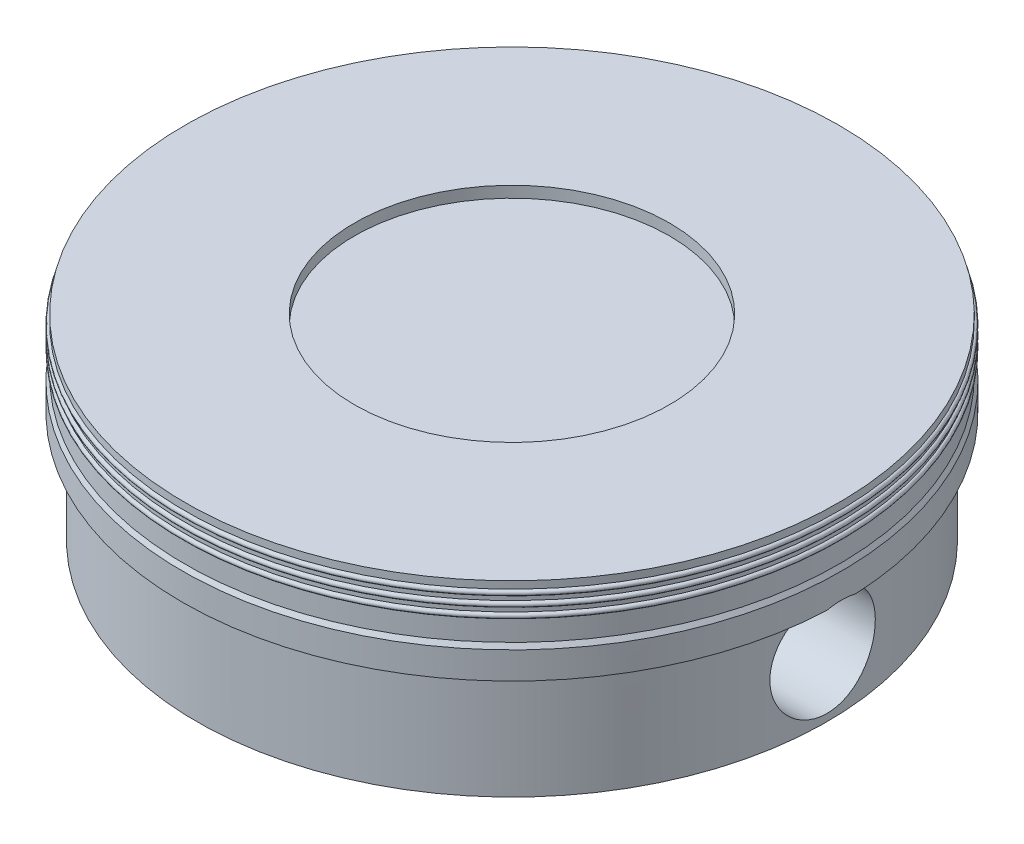
ISO-10303-21;
HEADER;
FILE_DESCRIPTION(('STEP AP214'),'2;1');
FILE_NAME('part.step','',(''),(''),'','','');
FILE_SCHEMA(('AUTOMOTIVE_DESIGN { 1 0 10303 214 1 1 1 1 }'));
ENDSEC;
DATA;
#1=APPLICATION_CONTEXT('core data for automotive mechanical design processes');
#2=APPLICATION_PROTOCOL_DEFINITION('international standard','automotive_design',2000,#1);
#3=PRODUCT_CONTEXT('',#1,'mechanical');
#4=PRODUCT('Part','Part','',(#3));
#5=PRODUCT_RELATED_PRODUCT_CATEGORY('part','',(#4));
#6=PRODUCT_DEFINITION_FORMATION('','',#4);
#7=PRODUCT_DEFINITION_CONTEXT('part definition',#1,'design');
#8=PRODUCT_DEFINITION('design','',#6,#7);
#9=PRODUCT_DEFINITION_SHAPE('','',#8);
#10=(LENGTH_UNIT() NAMED_UNIT(*) SI_UNIT(.MILLI.,.METRE.));
#11=(NAMED_UNIT(*) PLANE_ANGLE_UNIT() SI_UNIT($,.RADIAN.));
#12=(NAMED_UNIT(*) SI_UNIT($,.STERADIAN.) SOLID_ANGLE_UNIT());
#13=UNCERTAINTY_MEASURE_WITH_UNIT(LENGTH_MEASURE(1.E-05),#10,'distance_accuracy_value','');
#14=(GEOMETRIC_REPRESENTATION_CONTEXT(3) GLOBAL_UNCERTAINTY_ASSIGNED_CONTEXT((#13)) GLOBAL_UNIT_ASSIGNED_CONTEXT((#10,
#11,#12)) REPRESENTATION_CONTEXT('',''));
#15=CARTESIAN_POINT('',(0.,0.,0.));
#16=DIRECTION('',(0.,0.,1.));
#17=DIRECTION('',(1.,0.,0.));
#18=AXIS2_PLACEMENT_3D('',#15,#16,#17);
#19=CARTESIAN_POINT('',(5.,1.68,0.));
#20=DIRECTION('',(0.,-1.,0.));
#21=DIRECTION('',(0.,0.,-1.));
#22=AXIS2_PLACEMENT_3D('',#19,#20,#21);
#23=PLANE('',#22);
#24=DIRECTION('',(1.,0.,0.));
#25=VECTOR('',#24,1.);
#26=CARTESIAN_POINT('',(-5.,1.68,-0.217025344142108));
#27=LINE('',#26,#25);
#28=CARTESIAN_POINT('',(-4.99528777949779,1.68,-0.217025344142108));
#29=VERTEX_POINT('',#28);
#30=CARTESIAN_POINT('',(-4.77507068010516,1.68,-0.217025344142108));
#31=VERTEX_POINT('',#30);
#32=EDGE_CURVE('E115',#29,#31,#27,.T.);
#33=ORIENTED_EDGE('',*,*,#32,.F.);
#34=CARTESIAN_POINT('',(0.,1.68,0.));
#35=DIRECTION('',(0.,-1.,0.));
#36=DIRECTION('',(0.,0.,-1.));
#37=AXIS2_PLACEMENT_3D('',#34,#35,#36);
#38=CIRCLE('',#37,5.);
#39=CARTESIAN_POINT('',(4.99528777949779,1.68,-0.217025344142108));
#40=VERTEX_POINT('',#39);
#41=EDGE_CURVE('E129',#29,#40,#38,.T.);
#42=ORIENTED_EDGE('',*,*,#41,.T.);
#43=CARTESIAN_POINT('',(4.77507068010516,1.68,-0.217025344142108));
#44=VERTEX_POINT('',#43);
#45=EDGE_CURVE('E134',#44,#40,#27,.T.);
#46=ORIENTED_EDGE('',*,*,#45,.F.);
#47=CARTESIAN_POINT('',(0.,1.68,0.));
#48=DIRECTION('',(0.,-1.,0.));
#49=DIRECTION('',(0.,0.,-1.));
#50=AXIS2_PLACEMENT_3D('',#47,#48,#49);
#51=CIRCLE('',#50,4.78);
#52=EDGE_CURVE('E131',#31,#44,#51,.T.);
#53=ORIENTED_EDGE('',*,*,#52,.F.);
#54=EDGE_LOOP('',(#33,#42,#46,#53));
#55=FACE_BOUND('',#54,.T.);
#56=ADVANCED_FACE('F34',(#55),#23,.T.);
#57=CARTESIAN_POINT('',(0.,0.,0.));
#58=DIRECTION('',(0.,-1.,0.));
#59=DIRECTION('',(0.,0.,-1.));
#60=AXIS2_PLACEMENT_3D('',#57,#58,#59);
#61=CYLINDRICAL_SURFACE('',#60,3.43);
#62=DIRECTION('',(0.,-1.,0.));
#63=VECTOR('',#62,1.);
#64=CARTESIAN_POINT('',(1.75,2.972,-2.94998305079877));
#65=LINE('',#64,#63);
#66=CARTESIAN_POINT('',(1.75,1.93,-2.94998305079877));
#67=VERTEX_POINT('',#66);
#68=CARTESIAN_POINT('',(1.75,0.,-2.94998305079877));
#69=VERTEX_POINT('',#68);
#70=EDGE_CURVE('E221',#67,#69,#65,.T.);
#71=ORIENTED_EDGE('',*,*,#70,.F.);
#72=CARTESIAN_POINT('',(0.,1.93,0.));
#73=DIRECTION('',(0.,-1.,0.));
#74=DIRECTION('',(0.,0.,-1.));
#75=AXIS2_PLACEMENT_3D('',#72,#73,#74);
#76=CIRCLE('',#75,3.43);
#77=CARTESIAN_POINT('',(-1.75,1.93,-2.94998305079877));
#78=VERTEX_POINT('',#77);
#79=EDGE_CURVE('E247',#78,#67,#76,.T.);
#80=ORIENTED_EDGE('',*,*,#79,.F.);
#81=DIRECTION('',(0.,-1.,0.));
#82=VECTOR('',#81,1.);
#83=CARTESIAN_POINT('',(-1.75,2.972,-2.94998305079877));
#84=LINE('',#83,#82);
#85=CARTESIAN_POINT('',(-1.75,0.,-2.94998305079877));
#86=VERTEX_POINT('',#85);
#87=EDGE_CURVE('E237',#78,#86,#84,.T.);
#88=ORIENTED_EDGE('',*,*,#87,.T.);
#89=CARTESIAN_POINT('',(0.,0.,0.));
#90=DIRECTION('',(0.,-1.,0.));
#91=DIRECTION('',(0.,0.,-1.));
#92=AXIS2_PLACEMENT_3D('',#89,#90,#91);
#93=CIRCLE('',#92,3.43);
#94=EDGE_CURVE('E11',#86,#69,#93,.T.);
#95=ORIENTED_EDGE('',*,*,#94,.T.);
#96=EDGE_LOOP('',(#71,#80,#88,#95));
#97=FACE_BOUND('',#96,.T.);
#98=ADVANCED_FACE('F298',(#97),#61,.F.);
#99=DIRECTION('',(0.,-1.,0.));
#100=VECTOR('',#99,1.);
#101=CARTESIAN_POINT('',(1.75,2.972,2.94998305079877));
#102=LINE('',#101,#100);
#103=CARTESIAN_POINT('',(1.75,1.93,2.94998305079877));
#104=VERTEX_POINT('',#103);
#105=CARTESIAN_POINT('',(1.75,0.,2.94998305079877));
#106=VERTEX_POINT('',#105);
#107=EDGE_CURVE('E227',#104,#106,#102,.T.);
#108=ORIENTED_EDGE('',*,*,#107,.T.);
#109=CARTESIAN_POINT('',(-1.75,0.,2.94998305079877));
#110=VERTEX_POINT('',#109);
#111=EDGE_CURVE('E43',#106,#110,#93,.T.);
#112=ORIENTED_EDGE('',*,*,#111,.T.);
#113=DIRECTION('',(0.,-1.,0.));
#114=VECTOR('',#113,1.);
#115=CARTESIAN_POINT('',(-1.75,2.972,2.94998305079877));
#116=LINE('',#115,#114);
#117=CARTESIAN_POINT('',(-1.75,1.93,2.94998305079877));
#118=VERTEX_POINT('',#117);
#119=EDGE_CURVE('E236',#118,#110,#116,.T.);
#120=ORIENTED_EDGE('',*,*,#119,.F.);
#121=EDGE_CURVE('E232',#104,#118,#76,.T.);
#122=ORIENTED_EDGE('',*,*,#121,.F.);
#123=EDGE_LOOP('',(#108,#112,#120,#122));
#124=FACE_BOUND('',#123,.T.);
#125=ADVANCED_FACE('F36',(#124),#61,.F.);
#126=CARTESIAN_POINT('',(4.78,0.,0.));
#127=DIRECTION('',(0.,-1.,0.));
#128=DIRECTION('',(0.,0.,-1.));
#129=AXIS2_PLACEMENT_3D('',#126,#127,#128);
#130=PLANE('',#129);
#131=CARTESIAN_POINT('',(0.,0.,0.));
#132=DIRECTION('',(0.,-1.,0.));
#133=DIRECTION('',(0.,0.,-1.));
#134=AXIS2_PLACEMENT_3D('',#131,#132,#133);
#135=CIRCLE('',#134,4.78);
#136=CARTESIAN_POINT('',(0.,0.,-4.78));
#137=VERTEX_POINT('',#136);
#138=EDGE_CURVE('E149',#137,#137,#135,.T.);
#139=ORIENTED_EDGE('',*,*,#138,.T.);
#140=EDGE_LOOP('',(#139));
#141=FACE_BOUND('',#140,.T.);
#142=ORIENTED_EDGE('',*,*,#94,.F.);
#143=DIRECTION('',(0.,0.,1.));
#144=VECTOR('',#143,1.);
#145=CARTESIAN_POINT('',(-1.75,0.,2.94998305079877));
#146=LINE('',#145,#144);
#147=EDGE_CURVE('E229',#86,#110,#146,.T.);
#148=ORIENTED_EDGE('',*,*,#147,.T.);
#149=ORIENTED_EDGE('',*,*,#111,.F.);
#150=DIRECTION('',(0.,0.,-1.));
#151=VECTOR('',#150,1.);
#152=CARTESIAN_POINT('',(1.75,0.,2.94998305079877));
#153=LINE('',#152,#151);
#154=EDGE_CURVE('E220',#106,#69,#153,.T.);
#155=ORIENTED_EDGE('',*,*,#154,.T.);
#156=EDGE_LOOP('',(#142,#148,#149,#155));
#157=FACE_BOUND('',#156,.T.);
#158=ADVANCED_FACE('F308',(#141,#157),#130,.T.);
#159=CARTESIAN_POINT('',(0.,0.,0.));
#160=DIRECTION('',(0.,-1.,0.));
#161=DIRECTION('',(0.,0.,-1.));
#162=AXIS2_PLACEMENT_3D('',#159,#160,#161);
#163=CYLINDRICAL_SURFACE('',#162,4.78);
#164=CARTESIAN_POINT('',(-4.77507068010516,1.68,-0.217025344142108));
#165=CARTESIAN_POINT('',(-4.77311674454233,1.66781545501285,-0.260389997840914));
#166=CARTESIAN_POINT('',(-4.77058685151336,1.65191421075662,-0.302658617409448));
#167=CARTESIAN_POINT('',(-4.76473120839085,1.61331601743286,-0.383861318073952));
#168=CARTESIAN_POINT('',(-4.76140626252574,1.59062592976735,-0.422798715140795));
#169=CARTESIAN_POINT('',(-4.75431061348991,1.53905634512323,-0.496294501252224));
#170=CARTESIAN_POINT('',(-4.75053983511395,1.51017580323822,-0.530852149456165));
#171=CARTESIAN_POINT('',(-4.7429770373271,1.44704123469794,-0.594642145847165));
#172=CARTESIAN_POINT('',(-4.7391850190532,1.41278749307178,-0.623874776329791));
#173=CARTESIAN_POINT('',(-4.73198231554192,1.33963445348543,-0.676351887298078));
#174=CARTESIAN_POINT('',(-4.72857386348334,1.30071042802205,-0.699562233458879));
#175=CARTESIAN_POINT('',(-4.722554449733,1.21945126202537,-0.73910854464259));
#176=CARTESIAN_POINT('',(-4.7199435335669,1.17711592693891,-0.755444117253648));
#177=CARTESIAN_POINT('',(-4.71583989573606,1.09055475865284,-0.780651928805573));
#178=CARTESIAN_POINT('',(-4.71433931182688,1.04634460825845,-0.789576699682988));
#179=CARTESIAN_POINT('',(-4.71260225277348,0.957032751672788,-0.799880045235941));
#180=CARTESIAN_POINT('',(-4.71236561191707,0.911931163133861,-0.801259609143973));
#181=CARTESIAN_POINT('',(-4.71317900815314,0.822677727153014,-0.796460213173481));
#182=CARTESIAN_POINT('',(-4.71421397175652,0.778520946037444,-0.790369803192592));
#183=CARTESIAN_POINT('',(-4.7174257766452,0.691867355104175,-0.770966694821859));
#184=CARTESIAN_POINT('',(-4.71960265705314,0.649370602213479,-0.757653748983772));
#185=CARTESIAN_POINT('',(-4.72485660636636,0.56713060397223,-0.724165813365828));
#186=CARTESIAN_POINT('',(-4.72793556010964,0.527393341700135,-0.703976441127867));
#187=CARTESIAN_POINT('',(-4.73464750015667,0.451846186290576,-0.657317733090283));
#188=CARTESIAN_POINT('',(-4.7382805289058,0.416036594397233,-0.630847916085479));
#189=CARTESIAN_POINT('',(-4.74574814670546,0.348880399682881,-0.571982147608413));
#190=CARTESIAN_POINT('',(-4.74958470463595,0.317596008918017,-0.539515441920733));
#191=CARTESIAN_POINT('',(-4.75698830468753,0.26090071643192,-0.469776200289964));
#192=CARTESIAN_POINT('',(-4.76055533948057,0.23548997437027,-0.43250353375245));
#193=CARTESIAN_POINT('',(-4.76703400126186,0.1911835506644,-0.354034042364042));
#194=CARTESIAN_POINT('',(-4.76994321603747,0.172311716637692,-0.312823538628382));
#195=CARTESIAN_POINT('',(-4.77476061322142,0.141776205047494,-0.227758381569901));
#196=CARTESIAN_POINT('',(-4.77666887341471,0.13011196736357,-0.183903934005386));
#197=CARTESIAN_POINT('',(-4.77925311923535,0.114437264129416,-0.0953004936420972));
#198=CARTESIAN_POINT('',(-4.77994216086845,0.110345684668121,-0.0505662307842665));
#199=CARTESIAN_POINT('',(-4.78005079027309,0.109696432804759,0.0389570033491305));
#200=CARTESIAN_POINT('',(-4.7794704468681,0.113138351951783,0.0837459715270977));
#201=CARTESIAN_POINT('',(-4.77711565664269,0.127387693539074,0.171718625850184));
#202=CARTESIAN_POINT('',(-4.77535116971636,0.138133690579977,0.214912556661851));
#203=CARTESIAN_POINT('',(-4.77083222456877,0.16660481485125,0.298879816869771));
#204=CARTESIAN_POINT('',(-4.76807772295137,0.184330248020286,0.33965304006584));
#205=CARTESIAN_POINT('',(-4.76185735284645,0.226392438799284,0.417933619716713));
#206=CARTESIAN_POINT('',(-4.75838675692455,0.25077349929401,0.455416783633629));
#207=CARTESIAN_POINT('',(-4.75112593986705,0.305410165362693,0.525790773700132));
#208=CARTESIAN_POINT('',(-4.74733569379902,0.335666229422007,0.558681241091011));
#209=CARTESIAN_POINT('',(-4.73980727708292,0.401614121406434,0.619333370466703));
#210=CARTESIAN_POINT('',(-4.73607022605573,0.437365119679956,0.64703088003082));
#211=CARTESIAN_POINT('',(-4.72911708259974,0.513054069657324,0.69603621201228));
#212=CARTESIAN_POINT('',(-4.72590098778355,0.552992002172202,0.717344063712075));
#213=CARTESIAN_POINT('',(-4.72036394830086,0.635881027755403,0.752920794222775));
#214=CARTESIAN_POINT('',(-4.71804171930698,0.678827692065178,0.767199780566341));
#215=CARTESIAN_POINT('',(-4.71455803308112,0.766555057162941,0.788326469780904));
#216=CARTESIAN_POINT('',(-4.71339644749025,0.811335554571722,0.795174994415193));
#217=CARTESIAN_POINT('',(-4.71237792548226,0.900855119314812,0.801188832970666));
#218=CARTESIAN_POINT('',(-4.712504716309,0.945587583461906,0.800449977549886));
#219=CARTESIAN_POINT('',(-4.7140089366155,1.03428625093363,0.791542596891841));
#220=CARTESIAN_POINT('',(-4.71538641020498,1.07825242717667,0.783373809611892));
#221=CARTESIAN_POINT('',(-4.71922515448502,1.16399796218298,0.759903429890645));
#222=CARTESIAN_POINT('',(-4.72168213100792,1.2057852589046,0.744630084761228));
#223=CARTESIAN_POINT('',(-4.72740111237165,1.28620740457162,0.707411877504114));
#224=CARTESIAN_POINT('',(-4.73066306052802,1.32484247523554,0.685467485112687));
#225=CARTESIAN_POINT('',(-4.73766913754596,1.39832684053879,0.635246489063792));
#226=CARTESIAN_POINT('',(-4.74141811176241,1.43313053715318,0.606903797016646));
#227=CARTESIAN_POINT('',(-4.7489532451895,1.4975217381228,0.544812975714157));
#228=CARTESIAN_POINT('',(-4.75273941333657,1.5271079548491,0.511063516026313));
#229=CARTESIAN_POINT('',(-4.76019658054344,1.58221567707855,0.436382904178649));
#230=CARTESIAN_POINT('',(-4.76383860975078,1.60727795424229,0.395106051997313));
#231=CARTESIAN_POINT('',(-4.76862414691184,1.63903057077708,0.330299567261004));
#232=CARTESIAN_POINT('',(-4.77010793138987,1.6486502148414,0.308184135262337));
#233=CARTESIAN_POINT('',(-4.77280388719458,1.6658617378349,0.263159914490986));
#234=CARTESIAN_POINT('',(-4.77401603731461,1.67345345845173,0.240251063936713));
#235=CARTESIAN_POINT('',(-4.77507068010516,1.68,0.217025344142108));
#236=B_SPLINE_CURVE_WITH_KNOTS('',3,(#164,#165,#166,#167,#168,#169,#170,#171,#172,#173,#174,
#175,#176,#177,#178,#179,#180,#181,#182,#183,#184,#185,#186,#187,#188,#189,#190,#191,#192,#193,
#194,#195,#196,#197,#198,#199,#200,#201,#202,#203,#204,#205,#206,#207,#208,#209,#210,#211,#212,
#213,#214,#215,#216,#217,#218,#219,#220,#221,#222,#223,#224,#225,#226,#227,#228,#229,#230,#231,
#232,#233,#234,#235),.UNSPECIFIED.,.F.,.F.,(4,2,2,2,2,2,2,2,2,2,2,2,2,2,2,2,2,2,2,2,2,2,2,2,2,2,
2,2,2,2,2,2,2,2,2,4),(0.,0.135061280341502,0.269986514358779,0.404934540793564,
0.539875411135068,0.67556519591663,0.81126272481659,0.945989937250957,1.08069948552684,
1.21382749053972,1.34696005688289,1.48037280557488,1.61379577960147,1.74890717311241,
1.88402223883692,2.01962501133353,2.15521724447197,2.28934849434868,2.42347247208309,
2.556482234058,2.6894978270713,2.82342138218052,2.95735539288927,3.09284832298829,
3.22834063214234,3.36363752953001,3.49891946238859,3.63249487099912,3.76607499079898,
3.89912848475602,4.03217261203068,4.16665952396069,4.30117957979026,4.4455970880261,
4.5179990352962,4.59040663306323),.UNSPECIFIED.);
#237=CARTESIAN_POINT('',(-4.77507068010516,1.68,0.217025344142108));
#238=VERTEX_POINT('',#237);
#239=EDGE_CURVE('E132',#31,#238,#236,.T.);
#240=ORIENTED_EDGE('',*,*,#239,.F.);
#241=ORIENTED_EDGE('',*,*,#52,.T.);
#242=CARTESIAN_POINT('',(4.77507068010516,1.68,0.217025344142108));
#243=CARTESIAN_POINT('',(4.77311674454233,1.66781545501285,0.260389997840914));
#244=CARTESIAN_POINT('',(4.77058685151336,1.65191421075662,0.302658617409448));
#245=CARTESIAN_POINT('',(4.76473120839085,1.61331601743286,0.383861318073952));
#246=CARTESIAN_POINT('',(4.76140626252574,1.59062592976735,0.422798715140795));
#247=CARTESIAN_POINT('',(4.75431061348991,1.53905634512323,0.496294501252224));
#248=CARTESIAN_POINT('',(4.75053983511395,1.51017580323822,0.530852149456165));
#249=CARTESIAN_POINT('',(4.7429770373271,1.44704123469794,0.594642145847165));
#250=CARTESIAN_POINT('',(4.7391850190532,1.41278749307178,0.623874776329791));
#251=CARTESIAN_POINT('',(4.73198231554192,1.33963445348543,0.676351887298078));
#252=CARTESIAN_POINT('',(4.72857386348334,1.30071042802205,0.699562233458879));
#253=CARTESIAN_POINT('',(4.722554449733,1.21945126202537,0.73910854464259));
#254=CARTESIAN_POINT('',(4.7199435335669,1.17711592693891,0.755444117253648));
#255=CARTESIAN_POINT('',(4.71583989573606,1.09055475865284,0.780651928805573));
#256=CARTESIAN_POINT('',(4.71433931182688,1.04634460825845,0.789576699682988));
#257=CARTESIAN_POINT('',(4.71260225277348,0.957032751672788,0.799880045235941));
#258=CARTESIAN_POINT('',(4.71236561191707,0.911931163133861,0.801259609143973));
#259=CARTESIAN_POINT('',(4.71317900815314,0.822677727153014,0.796460213173481));
#260=CARTESIAN_POINT('',(4.71421397175652,0.778520946037444,0.790369803192592));
#261=CARTESIAN_POINT('',(4.7174257766452,0.691867355104175,0.770966694821859));
#262=CARTESIAN_POINT('',(4.71960265705314,0.649370602213479,0.757653748983772));
#263=CARTESIAN_POINT('',(4.72485660636636,0.56713060397223,0.724165813365828));
#264=CARTESIAN_POINT('',(4.72793556010964,0.527393341700135,0.703976441127867));
#265=CARTESIAN_POINT('',(4.73464750015667,0.451846186290576,0.657317733090283));
#266=CARTESIAN_POINT('',(4.7382805289058,0.416036594397233,0.630847916085479));
#267=CARTESIAN_POINT('',(4.74574814670546,0.348880399682881,0.571982147608413));
#268=CARTESIAN_POINT('',(4.74958470463595,0.317596008918017,0.539515441920733));
#269=CARTESIAN_POINT('',(4.75698830468753,0.26090071643192,0.469776200289964));
#270=CARTESIAN_POINT('',(4.76055533948057,0.23548997437027,0.43250353375245));
#271=CARTESIAN_POINT('',(4.76703400126186,0.1911835506644,0.354034042364042));
#272=CARTESIAN_POINT('',(4.76994321603747,0.172311716637692,0.312823538628382));
#273=CARTESIAN_POINT('',(4.77476061322142,0.141776205047494,0.227758381569901));
#274=CARTESIAN_POINT('',(4.77666887341471,0.13011196736357,0.183903934005386));
#275=CARTESIAN_POINT('',(4.77925311923535,0.114437264129416,0.0953004936420972));
#276=CARTESIAN_POINT('',(4.77994216086845,0.110345684668121,0.0505662307842665));
#277=CARTESIAN_POINT('',(4.78005079027309,0.109696432804759,-0.0389570033491305));
#278=CARTESIAN_POINT('',(4.7794704468681,0.113138351951783,-0.0837459715270977));
#279=CARTESIAN_POINT('',(4.77711565664269,0.127387693539074,-0.171718625850184));
#280=CARTESIAN_POINT('',(4.77535116971636,0.138133690579977,-0.214912556661851));
#281=CARTESIAN_POINT('',(4.77083222456877,0.16660481485125,-0.298879816869771));
#282=CARTESIAN_POINT('',(4.76807772295137,0.184330248020286,-0.33965304006584));
#283=CARTESIAN_POINT('',(4.76185735284645,0.226392438799284,-0.417933619716713));
#284=CARTESIAN_POINT('',(4.75838675692455,0.25077349929401,-0.455416783633629));
#285=CARTESIAN_POINT('',(4.75112593986705,0.305410165362693,-0.525790773700132));
#286=CARTESIAN_POINT('',(4.74733569379902,0.335666229422007,-0.558681241091011));
#287=CARTESIAN_POINT('',(4.73980727708292,0.401614121406434,-0.619333370466703));
#288=CARTESIAN_POINT('',(4.73607022605573,0.437365119679956,-0.64703088003082));
#289=CARTESIAN_POINT('',(4.72911708259974,0.513054069657324,-0.69603621201228));
#290=CARTESIAN_POINT('',(4.72590098778355,0.552992002172202,-0.717344063712075));
#291=CARTESIAN_POINT('',(4.72036394830086,0.635881027755403,-0.752920794222775));
#292=CARTESIAN_POINT('',(4.71804171930698,0.678827692065178,-0.767199780566341));
#293=CARTESIAN_POINT('',(4.71455803308112,0.766555057162941,-0.788326469780904));
#294=CARTESIAN_POINT('',(4.71339644749025,0.811335554571722,-0.795174994415193));
#295=CARTESIAN_POINT('',(4.71237792548226,0.900855119314812,-0.801188832970666));
#296=CARTESIAN_POINT('',(4.712504716309,0.945587583461906,-0.800449977549886));
#297=CARTESIAN_POINT('',(4.7140089366155,1.03428625093363,-0.791542596891841));
#298=CARTESIAN_POINT('',(4.71538641020498,1.07825242717667,-0.783373809611892));
#299=CARTESIAN_POINT('',(4.71922515448502,1.16399796218298,-0.759903429890645));
#300=CARTESIAN_POINT('',(4.72168213100792,1.2057852589046,-0.744630084761228));
#301=CARTESIAN_POINT('',(4.72740111237165,1.28620740457162,-0.707411877504114));
#302=CARTESIAN_POINT('',(4.73066306052802,1.32484247523554,-0.685467485112687));
#303=CARTESIAN_POINT('',(4.73766913754596,1.39832684053879,-0.635246489063792));
#304=CARTESIAN_POINT('',(4.74141811176241,1.43313053715318,-0.606903797016646));
#305=CARTESIAN_POINT('',(4.7489532451895,1.4975217381228,-0.544812975714157));
#306=CARTESIAN_POINT('',(4.75273941333657,1.5271079548491,-0.511063516026313));
#307=CARTESIAN_POINT('',(4.76019658054344,1.58221567707855,-0.436382904178649));
#308=CARTESIAN_POINT('',(4.76383860975078,1.60727795424229,-0.395106051997313));
#309=CARTESIAN_POINT('',(4.76862414691184,1.63903057077708,-0.330299567261004));
#310=CARTESIAN_POINT('',(4.77010793138987,1.6486502148414,-0.308184135262337));
#311=CARTESIAN_POINT('',(4.77280388719458,1.6658617378349,-0.263159914490986));
#312=CARTESIAN_POINT('',(4.77401603731461,1.67345345845173,-0.240251063936713));
#313=CARTESIAN_POINT('',(4.77507068010516,1.68,-0.217025344142108));
#314=B_SPLINE_CURVE_WITH_KNOTS('',3,(#242,#243,#244,#245,#246,#247,#248,#249,#250,#251,#252,
#253,#254,#255,#256,#257,#258,#259,#260,#261,#262,#263,#264,#265,#266,#267,#268,#269,#270,#271,
#272,#273,#274,#275,#276,#277,#278,#279,#280,#281,#282,#283,#284,#285,#286,#287,#288,#289,#290,
#291,#292,#293,#294,#295,#296,#297,#298,#299,#300,#301,#302,#303,#304,#305,#306,#307,#308,#309,
#310,#311,#312,#313),.UNSPECIFIED.,.F.,.F.,(4,2,2,2,2,2,2,2,2,2,2,2,2,2,2,2,2,2,2,2,2,2,2,2,2,2,
2,2,2,2,2,2,2,2,2,4),(0.,0.135061280341502,0.269986514358779,0.404934540793564,
0.539875411135068,0.67556519591663,0.81126272481659,0.945989937250957,1.08069948552684,
1.21382749053972,1.34696005688289,1.48037280557488,1.61379577960147,1.74890717311241,
1.88402223883692,2.01962501133353,2.15521724447197,2.28934849434868,2.42347247208309,
2.556482234058,2.6894978270713,2.82342138218052,2.95735539288927,3.09284832298829,
3.22834063214234,3.36363752953001,3.49891946238859,3.63249487099912,3.76607499079898,
3.89912848475602,4.03217261203068,4.16665952396069,4.30117957979026,4.4455970880261,
4.5179990352962,4.59040663306323),.UNSPECIFIED.);
#315=CARTESIAN_POINT('',(4.77507068010516,1.68,0.217025344142108));
#316=VERTEX_POINT('',#315);
#317=EDGE_CURVE('E159',#316,#44,#314,.T.);
#318=ORIENTED_EDGE('',*,*,#317,.F.);
#319=EDGE_CURVE('E148',#316,#238,#51,.T.);
#320=ORIENTED_EDGE('',*,*,#319,.T.);
#321=EDGE_LOOP('',(#240,#241,#318,#320));
#322=FACE_BOUND('',#321,.T.);
#323=ORIENTED_EDGE('',*,*,#138,.F.);
#324=EDGE_LOOP('',(#323));
#325=FACE_BOUND('',#324,.T.);
#326=ADVANCED_FACE('F157',(#322,#325),#163,.T.);
#327=DIRECTION('',(1.,0.,0.));
#328=VECTOR('',#327,1.);
#329=CARTESIAN_POINT('',(-5.,1.68,0.217025344142108));
#330=LINE('',#329,#328);
#331=CARTESIAN_POINT('',(4.99528777949779,1.68,0.217025344142108));
#332=VERTEX_POINT('',#331);
#333=EDGE_CURVE('E163',#332,#316,#330,.F.);
#334=ORIENTED_EDGE('',*,*,#333,.F.);
#335=CARTESIAN_POINT('',(-4.99528777949779,1.68,0.217025344142108));
#336=VERTEX_POINT('',#335);
#337=EDGE_CURVE('E139',#332,#336,#38,.T.);
#338=ORIENTED_EDGE('',*,*,#337,.T.);
#339=EDGE_CURVE('E118',#238,#336,#330,.F.);
#340=ORIENTED_EDGE('',*,*,#339,.F.);
#341=ORIENTED_EDGE('',*,*,#319,.F.);
#342=EDGE_LOOP('',(#334,#338,#340,#341));
#343=FACE_BOUND('',#342,.T.);
#344=ADVANCED_FACE('F162',(#343),#23,.T.);
#345=CARTESIAN_POINT('',(0.,0.,0.));
#346=DIRECTION('',(0.,-1.,0.));
#347=DIRECTION('',(0.,0.,-1.));
#348=AXIS2_PLACEMENT_3D('',#345,#346,#347);
#349=CYLINDRICAL_SURFACE('',#348,5.);
#350=CARTESIAN_POINT('',(4.99528777949779,1.68,-0.217025344142108));
#351=CARTESIAN_POINT('',(4.99622896774879,1.68610106058928,-0.195376542677369));
#352=CARTESIAN_POINT('',(4.99703852701703,1.69128766111012,-0.173477485348044));
#353=CARTESIAN_POINT('',(4.99837648438901,1.69980153137872,-0.129307503830497));
#354=CARTESIAN_POINT('',(4.9989048203015,1.70312838986114,-0.107036498509832));
#355=CARTESIAN_POINT('',(5.00002251450322,1.71015664531778,-0.0409416851132639));
#356=CARTESIAN_POINT('',(5.00019087516558,1.71119783067905,0.00321039652630593));
#357=CARTESIAN_POINT('',(4.99950986075141,1.70693153463769,0.0756308582289183));
#358=CARTESIAN_POINT('',(4.99899604063541,1.70371836424206,0.104050377357215));
#359=CARTESIAN_POINT('',(4.99749606245127,1.694208819851,0.160800504746172));
#360=CARTESIAN_POINT('',(4.99650285198295,1.6878663785966,0.189123213080513));
#361=CARTESIAN_POINT('',(4.99528777949779,1.68,0.217025344142108));
#362=B_SPLINE_CURVE_WITH_KNOTS('',3,(#350,#351,#352,#353,#354,#355,#356,#357,#358,#359,#360,
#361),.UNSPECIFIED.,.F.,.F.,(4,2,2,2,2,4),(0.,0.0674894445675056,0.134993807924421,
0.266780752005559,0.352446419941875,0.439412626048509),.UNSPECIFIED.);
#363=EDGE_CURVE('E138',#40,#332,#362,.T.);
#364=ORIENTED_EDGE('',*,*,#363,.F.);
#365=ORIENTED_EDGE('',*,*,#41,.F.);
#366=CARTESIAN_POINT('',(-4.99528777949779,1.68,0.217025344142108));
#367=CARTESIAN_POINT('',(-4.99622896774879,1.68610106058928,0.195376542677369));
#368=CARTESIAN_POINT('',(-4.99703852701703,1.69128766111012,0.173477485348044));
#369=CARTESIAN_POINT('',(-4.99837648438901,1.69980153137872,0.129307503830497));
#370=CARTESIAN_POINT('',(-4.9989048203015,1.70312838986114,0.107036498509832));
#371=CARTESIAN_POINT('',(-5.00002251450322,1.71015664531778,0.0409416851132639));
#372=CARTESIAN_POINT('',(-5.00019087516558,1.71119783067905,-0.00321039652630593));
#373=CARTESIAN_POINT('',(-4.99950986075141,1.70693153463769,-0.0756308582289183));
#374=CARTESIAN_POINT('',(-4.99899604063541,1.70371836424206,-0.104050377357215));
#375=CARTESIAN_POINT('',(-4.99749606245127,1.694208819851,-0.160800504746172));
#376=CARTESIAN_POINT('',(-4.99650285198295,1.6878663785966,-0.189123213080513));
#377=CARTESIAN_POINT('',(-4.99528777949779,1.68,-0.217025344142108));
#378=B_SPLINE_CURVE_WITH_KNOTS('',3,(#366,#367,#368,#369,#370,#371,#372,#373,#374,#375,#376,
#377),.UNSPECIFIED.,.F.,.F.,(4,2,2,2,2,4),(0.,0.0674894445675056,0.134993807924421,
0.266780752005559,0.352446419941875,0.439412626048509),.UNSPECIFIED.);
#379=EDGE_CURVE('E111',#336,#29,#378,.T.);
#380=ORIENTED_EDGE('',*,*,#379,.F.);
#381=ORIENTED_EDGE('',*,*,#337,.F.);
#382=EDGE_LOOP('',(#364,#365,#380,#381));
#383=FACE_BOUND('',#382,.T.);
#384=CARTESIAN_POINT('',(0.,2.09,0.));
#385=DIRECTION('',(0.,-1.,0.));
#386=DIRECTION('',(0.,0.,-1.));
#387=AXIS2_PLACEMENT_3D('',#384,#385,#386);
#388=CIRCLE('',#387,5.);
#389=CARTESIAN_POINT('',(0.,2.09,-5.));
#390=VERTEX_POINT('',#389);
#391=EDGE_CURVE('E140',#390,#390,#388,.T.);
#392=ORIENTED_EDGE('',*,*,#391,.T.);
#393=EDGE_LOOP('',(#392));
#394=FACE_BOUND('',#393,.T.);
#395=ADVANCED_FACE('F136',(#383,#394),#349,.T.);
#396=CARTESIAN_POINT('',(0.,2.09,0.));
#397=DIRECTION('',(0.,-1.,0.));
#398=DIRECTION('',(0.,0.,-1.));
#399=AXIS2_PLACEMENT_3D('',#396,#397,#398);
#400=CONICAL_SURFACE('',#399,5.,0.519146114246523);
#401=CARTESIAN_POINT('',(0.,2.16,0.));
#402=DIRECTION('',(0.,-1.,0.));
#403=DIRECTION('',(0.,0.,-1.));
#404=AXIS2_PLACEMENT_3D('',#401,#402,#403);
#405=CIRCLE('',#404,4.96);
#406=CARTESIAN_POINT('',(0.,2.16,-4.96));
#407=VERTEX_POINT('',#406);
#408=EDGE_CURVE('E143',#407,#407,#405,.T.);
#409=ORIENTED_EDGE('',*,*,#408,.T.);
#410=EDGE_LOOP('',(#409));
#411=FACE_BOUND('',#410,.T.);
#412=ORIENTED_EDGE('',*,*,#391,.F.);
#413=EDGE_LOOP('',(#412));
#414=FACE_BOUND('',#413,.T.);
#415=ADVANCED_FACE('F282',(#411,#414),#400,.T.);
#416=CARTESIAN_POINT('',(0.,0.,0.));
#417=DIRECTION('',(0.,-1.,0.));
#418=DIRECTION('',(0.,0.,-1.));
#419=AXIS2_PLACEMENT_3D('',#416,#417,#418);
#420=CYLINDRICAL_SURFACE('',#419,4.96);
#421=CARTESIAN_POINT('',(0.,2.48,0.));
#422=DIRECTION('',(0.,-1.,0.));
#423=DIRECTION('',(0.,0.,-1.));
#424=AXIS2_PLACEMENT_3D('',#421,#422,#423);
#425=CIRCLE('',#424,4.96);
#426=CARTESIAN_POINT('',(0.,2.48,-4.96));
#427=VERTEX_POINT('',#426);
#428=EDGE_CURVE('E277',#427,#427,#425,.T.);
#429=ORIENTED_EDGE('',*,*,#428,.T.);
#430=EDGE_LOOP('',(#429));
#431=FACE_BOUND('',#430,.T.);
#432=ORIENTED_EDGE('',*,*,#408,.F.);
#433=EDGE_LOOP('',(#432));
#434=FACE_BOUND('',#433,.T.);
#435=ADVANCED_FACE('F285',(#431,#434),#420,.T.);
#436=CARTESIAN_POINT('',(0.,2.52,0.));
#437=DIRECTION('',(0.,-1.,0.));
#438=DIRECTION('',(0.,0.,-1.));
#439=AXIS2_PLACEMENT_3D('',#436,#437,#438);
#440=TOROIDAL_SURFACE('',#439,4.96,0.0400000000000005);
#441=CARTESIAN_POINT('',(0.,2.56,0.));
#442=DIRECTION('',(0.,-1.,0.));
#443=DIRECTION('',(0.,0.,-1.));
#444=AXIS2_PLACEMENT_3D('',#441,#442,#443);
#445=CIRCLE('',#444,4.96);
#446=CARTESIAN_POINT('',(0.,2.56,-4.96));
#447=VERTEX_POINT('',#446);
#448=EDGE_CURVE('E274',#447,#447,#445,.T.);
#449=ORIENTED_EDGE('',*,*,#448,.T.);
#450=EDGE_LOOP('',(#449));
#451=FACE_BOUND('',#450,.T.);
#452=ORIENTED_EDGE('',*,*,#428,.F.);
#453=EDGE_LOOP('',(#452));
#454=FACE_BOUND('',#453,.T.);
#455=ADVANCED_FACE('F287',(#451,#454),#440,.T.);
#456=CARTESIAN_POINT('',(0.,0.,0.));
#457=DIRECTION('',(0.,-1.,0.));
#458=DIRECTION('',(0.,0.,-1.));
#459=AXIS2_PLACEMENT_3D('',#456,#457,#458);
#460=CYLINDRICAL_SURFACE('',#459,4.96);
#461=CARTESIAN_POINT('',(0.,2.63,0.));
#462=DIRECTION('',(0.,-1.,0.));
#463=DIRECTION('',(0.,0.,-1.));
#464=AXIS2_PLACEMENT_3D('',#461,#462,#463);
#465=CIRCLE('',#464,4.96);
#466=CARTESIAN_POINT('',(0.,2.63,-4.96));
#467=VERTEX_POINT('',#466);
#468=EDGE_CURVE('E271',#467,#467,#465,.T.);
#469=ORIENTED_EDGE('',*,*,#468,.T.);
#470=EDGE_LOOP('',(#469));
#471=FACE_BOUND('',#470,.T.);
#472=ORIENTED_EDGE('',*,*,#448,.F.);
#473=EDGE_LOOP('',(#472));
#474=FACE_BOUND('',#473,.T.);
#475=ADVANCED_FACE('F294',(#471,#474),#460,.T.);
#476=CARTESIAN_POINT('',(0.,2.67,0.));
#477=DIRECTION('',(0.,-1.,0.));
#478=DIRECTION('',(0.,0.,-1.));
#479=AXIS2_PLACEMENT_3D('',#476,#477,#478);
#480=TOROIDAL_SURFACE('',#479,4.96,0.0400000000000005);
#481=CARTESIAN_POINT('',(0.,2.71,0.));
#482=DIRECTION('',(0.,-1.,0.));
#483=DIRECTION('',(0.,0.,-1.));
#484=AXIS2_PLACEMENT_3D('',#481,#482,#483);
#485=CIRCLE('',#484,4.96);
#486=CARTESIAN_POINT('',(0.,2.71,-4.96));
#487=VERTEX_POINT('',#486);
#488=EDGE_CURVE('E268',#487,#487,#485,.T.);
#489=ORIENTED_EDGE('',*,*,#488,.T.);
#490=EDGE_LOOP('',(#489));
#491=FACE_BOUND('',#490,.T.);
#492=ORIENTED_EDGE('',*,*,#468,.F.);
#493=EDGE_LOOP('',(#492));
#494=FACE_BOUND('',#493,.T.);
#495=ADVANCED_FACE('F380',(#491,#494),#480,.T.);
#496=CARTESIAN_POINT('',(0.,0.,0.));
#497=DIRECTION('',(0.,-1.,0.));
#498=DIRECTION('',(0.,0.,-1.));
#499=AXIS2_PLACEMENT_3D('',#496,#497,#498);
#500=CYLINDRICAL_SURFACE('',#499,4.96);
#501=CARTESIAN_POINT('',(0.,2.78,0.));
#502=DIRECTION('',(0.,-1.,0.));
#503=DIRECTION('',(0.,0.,-1.));
#504=AXIS2_PLACEMENT_3D('',#501,#502,#503);
#505=CIRCLE('',#504,4.96);
#506=CARTESIAN_POINT('',(0.,2.78,-4.96));
#507=VERTEX_POINT('',#506);
#508=EDGE_CURVE('E265',#507,#507,#505,.T.);
#509=ORIENTED_EDGE('',*,*,#508,.T.);
#510=EDGE_LOOP('',(#509));
#511=FACE_BOUND('',#510,.T.);
#512=ORIENTED_EDGE('',*,*,#488,.F.);
#513=EDGE_LOOP('',(#512));
#514=FACE_BOUND('',#513,.T.);
#515=ADVANCED_FACE('F376',(#511,#514),#500,.T.);
#516=CARTESIAN_POINT('',(0.,2.82,0.));
#517=DIRECTION('',(0.,-1.,0.));
#518=DIRECTION('',(0.,0.,-1.));
#519=AXIS2_PLACEMENT_3D('',#516,#517,#518);
#520=TOROIDAL_SURFACE('',#519,4.96,0.0400000000000005);
#521=CARTESIAN_POINT('',(0.,2.86,0.));
#522=DIRECTION('',(0.,-1.,0.));
#523=DIRECTION('',(0.,0.,-1.));
#524=AXIS2_PLACEMENT_3D('',#521,#522,#523);
#525=CIRCLE('',#524,4.96);
#526=CARTESIAN_POINT('',(0.,2.86,-4.96));
#527=VERTEX_POINT('',#526);
#528=EDGE_CURVE('E262',#527,#527,#525,.T.);
#529=ORIENTED_EDGE('',*,*,#528,.T.);
#530=EDGE_LOOP('',(#529));
#531=FACE_BOUND('',#530,.T.);
#532=ORIENTED_EDGE('',*,*,#508,.F.);
#533=EDGE_LOOP('',(#532));
#534=FACE_BOUND('',#533,.T.);
#535=ADVANCED_FACE('F372',(#531,#534),#520,.T.);
#536=CARTESIAN_POINT('',(0.,0.,0.));
#537=DIRECTION('',(0.,-1.,0.));
#538=DIRECTION('',(0.,0.,-1.));
#539=AXIS2_PLACEMENT_3D('',#536,#537,#538);
#540=CYLINDRICAL_SURFACE('',#539,4.96);
#541=CARTESIAN_POINT('',(0.,2.97,0.));
#542=DIRECTION('',(0.,-1.,0.));
#543=DIRECTION('',(0.,0.,-1.));
#544=AXIS2_PLACEMENT_3D('',#541,#542,#543);
#545=CIRCLE('',#544,4.96);
#546=CARTESIAN_POINT('',(0.,2.97,-4.96));
#547=VERTEX_POINT('',#546);
#548=EDGE_CURVE('E259',#547,#547,#545,.T.);
#549=ORIENTED_EDGE('',*,*,#548,.T.);
#550=EDGE_LOOP('',(#549));
#551=FACE_BOUND('',#550,.T.);
#552=ORIENTED_EDGE('',*,*,#528,.F.);
#553=EDGE_LOOP('',(#552));
#554=FACE_BOUND('',#553,.T.);
#555=ADVANCED_FACE('F368',(#551,#554),#540,.T.);
#556=CARTESIAN_POINT('',(2.39,2.97,0.));
#557=DIRECTION('',(0.,1.,0.));
#558=DIRECTION('',(0.,0.,1.));
#559=AXIS2_PLACEMENT_3D('',#556,#557,#558);
#560=PLANE('',#559);
#561=CARTESIAN_POINT('',(0.,2.97,0.));
#562=DIRECTION('',(0.,-1.,0.));
#563=DIRECTION('',(0.,0.,-1.));
#564=AXIS2_PLACEMENT_3D('',#561,#562,#563);
#565=CIRCLE('',#564,2.39);
#566=CARTESIAN_POINT('',(0.,2.97,-2.39));
#567=VERTEX_POINT('',#566);
#568=EDGE_CURVE('E256',#567,#567,#565,.T.);
#569=ORIENTED_EDGE('',*,*,#568,.T.);
#570=EDGE_LOOP('',(#569));
#571=FACE_BOUND('',#570,.T.);
#572=ORIENTED_EDGE('',*,*,#548,.F.);
#573=EDGE_LOOP('',(#572));
#574=FACE_BOUND('',#573,.T.);
#575=ADVANCED_FACE('F364',(#571,#574),#560,.T.);
#576=CARTESIAN_POINT('',(0.,0.,0.));
#577=DIRECTION('',(0.,-1.,0.));
#578=DIRECTION('',(0.,0.,-1.));
#579=AXIS2_PLACEMENT_3D('',#576,#577,#578);
#580=CYLINDRICAL_SURFACE('',#579,2.39);
#581=CARTESIAN_POINT('',(0.,2.8,0.));
#582=DIRECTION('',(0.,-1.,0.));
#583=DIRECTION('',(0.,0.,-1.));
#584=AXIS2_PLACEMENT_3D('',#581,#582,#583);
#585=CIRCLE('',#584,2.39);
#586=CARTESIAN_POINT('',(0.,2.8,-2.39));
#587=VERTEX_POINT('',#586);
#588=EDGE_CURVE('E253',#587,#587,#585,.T.);
#589=ORIENTED_EDGE('',*,*,#588,.T.);
#590=EDGE_LOOP('',(#589));
#591=FACE_BOUND('',#590,.T.);
#592=ORIENTED_EDGE('',*,*,#568,.F.);
#593=EDGE_LOOP('',(#592));
#594=FACE_BOUND('',#593,.T.);
#595=ADVANCED_FACE('F360',(#591,#594),#580,.F.);
#596=CARTESIAN_POINT('',(0.,2.8,0.));
#597=DIRECTION('',(0.,1.,0.));
#598=DIRECTION('',(0.,0.,1.));
#599=AXIS2_PLACEMENT_3D('',#596,#597,#598);
#600=PLANE('',#599);
#601=ORIENTED_EDGE('',*,*,#588,.F.);
#602=EDGE_LOOP('',(#601));
#603=FACE_BOUND('',#602,.T.);
#604=ADVANCED_FACE('F345',(#603),#600,.T.);
#605=CARTESIAN_POINT('',(4.2,2.33,0.));
#606=DIRECTION('',(0.,-1.,0.));
#607=DIRECTION('',(0.,0.,-1.));
#608=AXIS2_PLACEMENT_3D('',#605,#606,#607);
#609=PLANE('',#608);
#610=CARTESIAN_POINT('',(0.,2.33,0.));
#611=DIRECTION('',(0.,-1.,0.));
#612=DIRECTION('',(0.,0.,-1.));
#613=AXIS2_PLACEMENT_3D('',#610,#611,#612);
#614=CIRCLE('',#613,3.43);
#615=CARTESIAN_POINT('',(1.75,2.33,2.94998305079877));
#616=VERTEX_POINT('',#615);
#617=CARTESIAN_POINT('',(1.75,2.33,-2.94998305079877));
#618=VERTEX_POINT('',#617);
#619=EDGE_CURVE('E216',#616,#618,#614,.F.);
#620=ORIENTED_EDGE('',*,*,#619,.T.);
#621=DIRECTION('',(0.,0.,1.));
#622=VECTOR('',#621,1.);
#623=CARTESIAN_POINT('',(1.75,2.33,2.94998305079877));
#624=LINE('',#623,#622);
#625=EDGE_CURVE('E49',#618,#616,#624,.T.);
#626=ORIENTED_EDGE('',*,*,#625,.T.);
#627=EDGE_LOOP('',(#620,#626));
#628=FACE_BOUND('',#627,.T.);
#629=CARTESIAN_POINT('',(0.,2.33,0.));
#630=DIRECTION('',(0.,-1.,0.));
#631=DIRECTION('',(0.,0.,-1.));
#632=AXIS2_PLACEMENT_3D('',#629,#630,#631);
#633=CIRCLE('',#632,3.43);
#634=CARTESIAN_POINT('',(-1.75,2.33,-2.94998305079877));
#635=VERTEX_POINT('',#634);
#636=CARTESIAN_POINT('',(-1.75,2.33,2.94998305079877));
#637=VERTEX_POINT('',#636);
#638=EDGE_CURVE('E240',#635,#637,#633,.F.);
#639=ORIENTED_EDGE('',*,*,#638,.T.);
#640=DIRECTION('',(0.,0.,-1.));
#641=VECTOR('',#640,1.);
#642=CARTESIAN_POINT('',(-1.75,2.33,2.94998305079877));
#643=LINE('',#642,#641);
#644=EDGE_CURVE('E224',#637,#635,#643,.T.);
#645=ORIENTED_EDGE('',*,*,#644,.T.);
#646=EDGE_LOOP('',(#639,#645));
#647=FACE_BOUND('',#646,.T.);
#648=CARTESIAN_POINT('',(0.,2.33,0.));
#649=DIRECTION('',(0.,-1.,0.));
#650=DIRECTION('',(0.,0.,-1.));
#651=AXIS2_PLACEMENT_3D('',#648,#649,#650);
#652=CIRCLE('',#651,4.2);
#653=CARTESIAN_POINT('',(0.,2.33,-4.2));
#654=VERTEX_POINT('',#653);
#655=EDGE_CURVE('E250',#654,#654,#652,.T.);
#656=ORIENTED_EDGE('',*,*,#655,.T.);
#657=EDGE_LOOP('',(#656));
#658=FACE_BOUND('',#657,.T.);
#659=ADVANCED_FACE('F341',(#628,#647,#658),#609,.T.);
#660=CARTESIAN_POINT('',(0.,0.,0.));
#661=DIRECTION('',(0.,-1.,0.));
#662=DIRECTION('',(0.,0.,-1.));
#663=AXIS2_PLACEMENT_3D('',#660,#661,#662);
#664=CYLINDRICAL_SURFACE('',#663,4.2);
#665=CARTESIAN_POINT('',(0.,1.93,0.));
#666=DIRECTION('',(0.,-1.,0.));
#667=DIRECTION('',(0.,0.,-1.));
#668=AXIS2_PLACEMENT_3D('',#665,#666,#667);
#669=CIRCLE('',#668,4.2);
#670=CARTESIAN_POINT('',(0.,1.93,-4.2));
#671=VERTEX_POINT('',#670);
#672=EDGE_CURVE('E246',#671,#671,#669,.T.);
#673=ORIENTED_EDGE('',*,*,#672,.T.);
#674=EDGE_LOOP('',(#673));
#675=FACE_BOUND('',#674,.T.);
#676=ORIENTED_EDGE('',*,*,#655,.F.);
#677=EDGE_LOOP('',(#676));
#678=FACE_BOUND('',#677,.T.);
#679=ADVANCED_FACE('F344',(#675,#678),#664,.F.);
#680=CARTESIAN_POINT('',(3.43,1.93,0.));
#681=DIRECTION('',(0.,1.,0.));
#682=DIRECTION('',(0.,0.,1.));
#683=AXIS2_PLACEMENT_3D('',#680,#681,#682);
#684=PLANE('',#683);
#685=EDGE_CURVE('E243',#118,#78,#76,.T.);
#686=ORIENTED_EDGE('',*,*,#685,.T.);
#687=ORIENTED_EDGE('',*,*,#79,.T.);
#688=EDGE_CURVE('E219',#67,#104,#76,.T.);
#689=ORIENTED_EDGE('',*,*,#688,.T.);
#690=ORIENTED_EDGE('',*,*,#121,.T.);
#691=EDGE_LOOP('',(#686,#687,#689,#690));
#692=FACE_BOUND('',#691,.T.);
#693=ORIENTED_EDGE('',*,*,#672,.F.);
#694=EDGE_LOOP('',(#693));
#695=FACE_BOUND('',#694,.T.);
#696=ADVANCED_FACE('F336',(#692,#695),#684,.T.);
#697=CARTESIAN_POINT('',(0.,2.972,0.));
#698=DIRECTION('',(0.,-1.,0.));
#699=DIRECTION('',(0.,0.,-1.));
#700=AXIS2_PLACEMENT_3D('',#697,#698,#699);
#701=CYLINDRICAL_SURFACE('',#700,3.43);
#702=EDGE_CURVE('E234',#635,#78,#84,.T.);
#703=ORIENTED_EDGE('',*,*,#702,.T.);
#704=ORIENTED_EDGE('',*,*,#685,.F.);
#705=EDGE_CURVE('E233',#637,#118,#116,.T.);
#706=ORIENTED_EDGE('',*,*,#705,.F.);
#707=ORIENTED_EDGE('',*,*,#638,.F.);
#708=EDGE_LOOP('',(#703,#704,#706,#707));
#709=FACE_BOUND('',#708,.T.);
#710=ADVANCED_FACE('F211',(#709),#701,.T.);
#711=CARTESIAN_POINT('',(-1.75,2.972,2.94998305079877));
#712=DIRECTION('',(1.,0.,0.));
#713=DIRECTION('',(0.,0.,-1.));
#714=AXIS2_PLACEMENT_3D('',#711,#712,#713);
#715=PLANE('',#714);
#716=CARTESIAN_POINT('',(-1.75,0.91,0.));
#717=DIRECTION('',(1.,0.,0.));
#718=DIRECTION('',(0.,0.,-1.));
#719=AXIS2_PLACEMENT_3D('',#716,#717,#718);
#720=CIRCLE('',#719,0.8);
#721=CARTESIAN_POINT('',(-1.75,0.91,-0.8));
#722=VERTEX_POINT('',#721);
#723=EDGE_CURVE('E123',#722,#722,#720,.T.);
#724=ORIENTED_EDGE('',*,*,#723,.F.);
#725=EDGE_LOOP('',(#724));
#726=FACE_BOUND('',#725,.T.);
#727=ORIENTED_EDGE('',*,*,#644,.F.);
#728=ORIENTED_EDGE('',*,*,#705,.T.);
#729=ORIENTED_EDGE('',*,*,#119,.T.);
#730=ORIENTED_EDGE('',*,*,#147,.F.);
#731=ORIENTED_EDGE('',*,*,#87,.F.);
#732=ORIENTED_EDGE('',*,*,#702,.F.);
#733=EDGE_LOOP('',(#727,#728,#729,#730,#731,#732));
#734=FACE_BOUND('',#733,.T.);
#735=ADVANCED_FACE('F328',(#726,#734),#715,.T.);
#736=CARTESIAN_POINT('',(0.,2.972,0.));
#737=DIRECTION('',(0.,-1.,0.));
#738=DIRECTION('',(0.,0.,-1.));
#739=AXIS2_PLACEMENT_3D('',#736,#737,#738);
#740=CYLINDRICAL_SURFACE('',#739,3.43);
#741=EDGE_CURVE('E56',#616,#104,#102,.T.);
#742=ORIENTED_EDGE('',*,*,#741,.T.);
#743=ORIENTED_EDGE('',*,*,#688,.F.);
#744=EDGE_CURVE('E214',#618,#67,#65,.T.);
#745=ORIENTED_EDGE('',*,*,#744,.F.);
#746=ORIENTED_EDGE('',*,*,#619,.F.);
#747=EDGE_LOOP('',(#742,#743,#745,#746));
#748=FACE_BOUND('',#747,.T.);
#749=ADVANCED_FACE('F193',(#748),#740,.T.);
#750=CARTESIAN_POINT('',(1.75,2.972,2.94998305079877));
#751=DIRECTION('',(-1.,0.,0.));
#752=DIRECTION('',(0.,0.,1.));
#753=AXIS2_PLACEMENT_3D('',#750,#751,#752);
#754=PLANE('',#753);
#755=CARTESIAN_POINT('',(1.75,0.91,0.));
#756=DIRECTION('',(-1.,0.,0.));
#757=DIRECTION('',(0.,0.,1.));
#758=AXIS2_PLACEMENT_3D('',#755,#756,#757);
#759=CIRCLE('',#758,0.8);
#760=CARTESIAN_POINT('',(1.75,0.91,0.8));
#761=VERTEX_POINT('',#760);
#762=EDGE_CURVE('E38',#761,#761,#759,.T.);
#763=ORIENTED_EDGE('',*,*,#762,.F.);
#764=EDGE_LOOP('',(#763));
#765=FACE_BOUND('',#764,.T.);
#766=ORIENTED_EDGE('',*,*,#625,.F.);
#767=ORIENTED_EDGE('',*,*,#744,.T.);
#768=ORIENTED_EDGE('',*,*,#70,.T.);
#769=ORIENTED_EDGE('',*,*,#154,.F.);
#770=ORIENTED_EDGE('',*,*,#107,.F.);
#771=ORIENTED_EDGE('',*,*,#741,.F.);
#772=EDGE_LOOP('',(#766,#767,#768,#769,#770,#771));
#773=FACE_BOUND('',#772,.T.);
#774=ADVANCED_FACE('F192',(#765,#773),#754,.T.);
#775=CARTESIAN_POINT('',(-5.,0.91,0.));
#776=DIRECTION('',(1.,0.,0.));
#777=DIRECTION('',(0.,0.,-1.));
#778=AXIS2_PLACEMENT_3D('',#775,#776,#777);
#779=CYLINDRICAL_SURFACE('',#778,0.8);
#780=ORIENTED_EDGE('',*,*,#317,.T.);
#781=ORIENTED_EDGE('',*,*,#45,.T.);
#782=ORIENTED_EDGE('',*,*,#363,.T.);
#783=ORIENTED_EDGE('',*,*,#333,.T.);
#784=EDGE_LOOP('',(#780,#781,#782,#783));
#785=FACE_BOUND('',#784,.T.);
#786=ORIENTED_EDGE('',*,*,#762,.T.);
#787=EDGE_LOOP('',(#786));
#788=FACE_BOUND('',#787,.T.);
#789=ADVANCED_FACE('F188',(#785,#788),#779,.F.);
#790=ORIENTED_EDGE('',*,*,#239,.T.);
#791=ORIENTED_EDGE('',*,*,#339,.T.);
#792=ORIENTED_EDGE('',*,*,#379,.T.);
#793=ORIENTED_EDGE('',*,*,#32,.T.);
#794=EDGE_LOOP('',(#790,#791,#792,#793));
#795=FACE_BOUND('',#794,.T.);
#796=ORIENTED_EDGE('',*,*,#723,.T.);
#797=EDGE_LOOP('',(#796));
#798=FACE_BOUND('',#797,.T.);
#799=ADVANCED_FACE('F113',(#795,#798),#779,.F.);
#800=CLOSED_SHELL('',(#56,#98,#125,#158,#326,#344,#395,#415,#435,#455,#475,#495,#515,#535,#555,
#575,#595,#604,#659,#679,#696,#710,#735,#749,#774,#789,#799));
#801=MANIFOLD_SOLID_BREP('B2',#800);
#802=ADVANCED_BREP_SHAPE_REPRESENTATION('',(#18,#801),#14);
#803=SHAPE_DEFINITION_REPRESENTATION(#9,#802);
ENDSEC;
END-ISO-10303-21;
